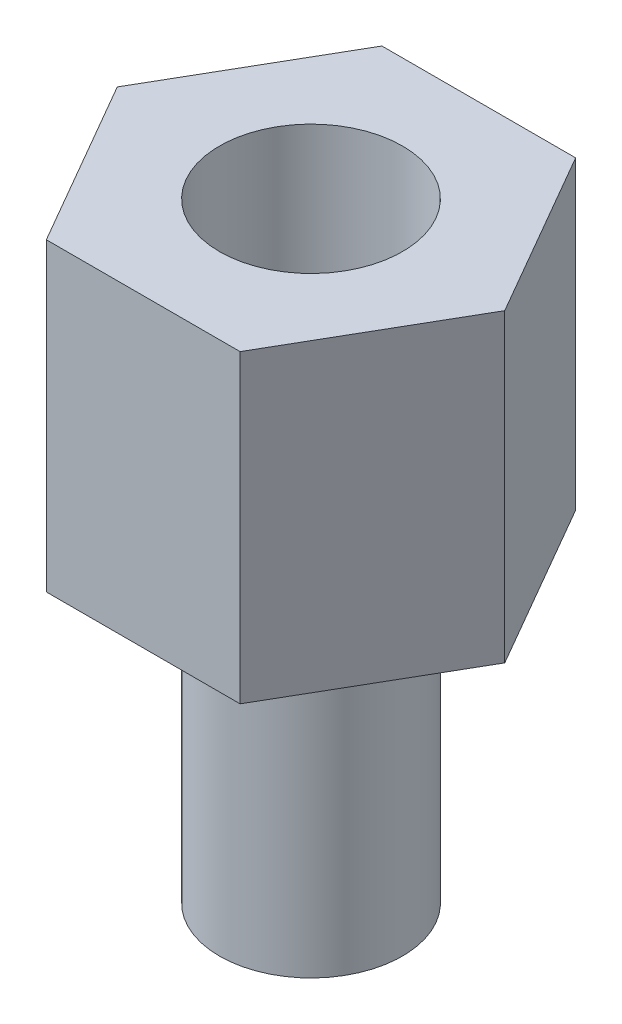
ISO-10303-21;
HEADER;
FILE_DESCRIPTION(('STEP AP214'),'2;1');
FILE_NAME('part.step','',(''),(''),'','','');
FILE_SCHEMA(('AUTOMOTIVE_DESIGN { 1 0 10303 214 1 1 1 1 }'));
ENDSEC;
DATA;
#1=APPLICATION_CONTEXT('core data for automotive mechanical design processes');
#2=APPLICATION_PROTOCOL_DEFINITION('international standard','automotive_design',2000,#1);
#3=PRODUCT_CONTEXT('',#1,'mechanical');
#4=PRODUCT('Part','Part','',(#3));
#5=PRODUCT_RELATED_PRODUCT_CATEGORY('part','',(#4));
#6=PRODUCT_DEFINITION_FORMATION('','',#4);
#7=PRODUCT_DEFINITION_CONTEXT('part definition',#1,'design');
#8=PRODUCT_DEFINITION('design','',#6,#7);
#9=PRODUCT_DEFINITION_SHAPE('','',#8);
#10=(LENGTH_UNIT() NAMED_UNIT(*) SI_UNIT(.MILLI.,.METRE.));
#11=(NAMED_UNIT(*) PLANE_ANGLE_UNIT() SI_UNIT($,.RADIAN.));
#12=(NAMED_UNIT(*) SI_UNIT($,.STERADIAN.) SOLID_ANGLE_UNIT());
#13=UNCERTAINTY_MEASURE_WITH_UNIT(LENGTH_MEASURE(1.E-05),#10,'distance_accuracy_value','');
#14=(GEOMETRIC_REPRESENTATION_CONTEXT(3) GLOBAL_UNCERTAINTY_ASSIGNED_CONTEXT((#13)) GLOBAL_UNIT_ASSIGNED_CONTEXT((#10,
#11,#12)) REPRESENTATION_CONTEXT('',''));
#15=CARTESIAN_POINT('',(0.,0.,0.));
#16=DIRECTION('',(0.,0.,1.));
#17=DIRECTION('',(1.,0.,0.));
#18=AXIS2_PLACEMENT_3D('',#15,#16,#17);
#19=CARTESIAN_POINT('',(0.,5.,0.));
#20=DIRECTION('',(0.,1.,0.));
#21=DIRECTION('',(0.,0.,1.));
#22=AXIS2_PLACEMENT_3D('',#19,#20,#21);
#23=PLANE('',#22);
#24=DIRECTION('',(1.,0.,0.));
#25=VECTOR('',#24,1.);
#26=CARTESIAN_POINT('',(-1.58771324027147,5.,2.75));
#27=LINE('',#26,#25);
#28=CARTESIAN_POINT('',(-1.58771324027147,5.,2.75));
#29=VERTEX_POINT('',#28);
#30=CARTESIAN_POINT('',(1.58771324027147,5.,2.75));
#31=VERTEX_POINT('',#30);
#32=EDGE_CURVE('E138',#29,#31,#27,.T.);
#33=ORIENTED_EDGE('',*,*,#32,.T.);
#34=DIRECTION('',(0.5,0.,-0.866025403784439));
#35=VECTOR('',#34,1.);
#36=CARTESIAN_POINT('',(1.58771324027147,5.,2.75));
#37=LINE('',#36,#35);
#38=CARTESIAN_POINT('',(3.17542648054294,5.,0.));
#39=VERTEX_POINT('',#38);
#40=EDGE_CURVE('E96',#31,#39,#37,.T.);
#41=ORIENTED_EDGE('',*,*,#40,.T.);
#42=DIRECTION('',(-0.5,0.,-0.866025403784438));
#43=VECTOR('',#42,1.);
#44=CARTESIAN_POINT('',(3.17542648054294,5.,0.));
#45=LINE('',#44,#43);
#46=CARTESIAN_POINT('',(1.58771324027147,5.,-2.75));
#47=VERTEX_POINT('',#46);
#48=EDGE_CURVE('E109',#39,#47,#45,.T.);
#49=ORIENTED_EDGE('',*,*,#48,.T.);
#50=DIRECTION('',(-1.,0.,0.));
#51=VECTOR('',#50,1.);
#52=CARTESIAN_POINT('',(1.58771324027147,5.,-2.75));
#53=LINE('',#52,#51);
#54=CARTESIAN_POINT('',(-1.58771324027147,5.,-2.75));
#55=VERTEX_POINT('',#54);
#56=EDGE_CURVE('E103',#47,#55,#53,.T.);
#57=ORIENTED_EDGE('',*,*,#56,.T.);
#58=DIRECTION('',(-0.5,0.,0.866025403784439));
#59=VECTOR('',#58,1.);
#60=CARTESIAN_POINT('',(-1.58771324027147,5.,-2.75));
#61=LINE('',#60,#59);
#62=CARTESIAN_POINT('',(-3.17542648054294,5.,0.));
#63=VERTEX_POINT('',#62);
#64=EDGE_CURVE('E107',#55,#63,#61,.T.);
#65=ORIENTED_EDGE('',*,*,#64,.T.);
#66=DIRECTION('',(0.5,0.,0.866025403784439));
#67=VECTOR('',#66,1.);
#68=CARTESIAN_POINT('',(-3.17542648054294,5.,0.));
#69=LINE('',#68,#67);
#70=EDGE_CURVE('E58',#63,#29,#69,.T.);
#71=ORIENTED_EDGE('',*,*,#70,.T.);
#72=EDGE_LOOP('',(#33,#41,#49,#57,#65,#71));
#73=FACE_BOUND('',#72,.T.);
#74=CARTESIAN_POINT('',(0.,5.,0.));
#75=DIRECTION('',(0.,1.,0.));
#76=DIRECTION('',(0.,0.,1.));
#77=AXIS2_PLACEMENT_3D('',#74,#75,#76);
#78=CIRCLE('',#77,1.5);
#79=CARTESIAN_POINT('',(0.,5.,1.5));
#80=VERTEX_POINT('',#79);
#81=EDGE_CURVE('E131',#80,#80,#78,.T.);
#82=ORIENTED_EDGE('',*,*,#81,.F.);
#83=EDGE_LOOP('',(#82));
#84=FACE_BOUND('',#83,.T.);
#85=ADVANCED_FACE('F41',(#73,#84),#23,.T.);
#86=CARTESIAN_POINT('',(0.,0.,0.));
#87=DIRECTION('',(0.,1.,0.));
#88=DIRECTION('',(0.,0.,1.));
#89=AXIS2_PLACEMENT_3D('',#86,#87,#88);
#90=PLANE('',#89);
#91=DIRECTION('',(1.,0.,0.));
#92=VECTOR('',#91,1.);
#93=CARTESIAN_POINT('',(-1.58771324027147,0.,2.75));
#94=LINE('',#93,#92);
#95=CARTESIAN_POINT('',(-1.58771324027147,0.,2.75));
#96=VERTEX_POINT('',#95);
#97=CARTESIAN_POINT('',(1.58771324027147,0.,2.75));
#98=VERTEX_POINT('',#97);
#99=EDGE_CURVE('E127',#96,#98,#94,.T.);
#100=ORIENTED_EDGE('',*,*,#99,.F.);
#101=DIRECTION('',(0.5,0.,0.866025403784439));
#102=VECTOR('',#101,1.);
#103=CARTESIAN_POINT('',(-3.17542648054294,0.,0.));
#104=LINE('',#103,#102);
#105=CARTESIAN_POINT('',(-3.17542648054294,0.,0.));
#106=VERTEX_POINT('',#105);
#107=EDGE_CURVE('E87',#106,#96,#104,.T.);
#108=ORIENTED_EDGE('',*,*,#107,.F.);
#109=DIRECTION('',(-0.5,0.,0.866025403784439));
#110=VECTOR('',#109,1.);
#111=CARTESIAN_POINT('',(-1.58771324027147,0.,-2.75));
#112=LINE('',#111,#110);
#113=CARTESIAN_POINT('',(-1.58771324027147,0.,-2.75));
#114=VERTEX_POINT('',#113);
#115=EDGE_CURVE('E81',#114,#106,#112,.T.);
#116=ORIENTED_EDGE('',*,*,#115,.F.);
#117=DIRECTION('',(-1.,0.,0.));
#118=VECTOR('',#117,1.);
#119=CARTESIAN_POINT('',(1.58771324027147,0.,-2.75));
#120=LINE('',#119,#118);
#121=CARTESIAN_POINT('',(1.58771324027147,0.,-2.75));
#122=VERTEX_POINT('',#121);
#123=EDGE_CURVE('E117',#122,#114,#120,.T.);
#124=ORIENTED_EDGE('',*,*,#123,.F.);
#125=DIRECTION('',(-0.5,0.,-0.866025403784438));
#126=VECTOR('',#125,1.);
#127=CARTESIAN_POINT('',(3.17542648054294,0.,0.));
#128=LINE('',#127,#126);
#129=CARTESIAN_POINT('',(3.17542648054294,0.,0.));
#130=VERTEX_POINT('',#129);
#131=EDGE_CURVE('E133',#130,#122,#128,.T.);
#132=ORIENTED_EDGE('',*,*,#131,.F.);
#133=DIRECTION('',(0.5,0.,-0.866025403784439));
#134=VECTOR('',#133,1.);
#135=CARTESIAN_POINT('',(1.58771324027147,0.,2.75));
#136=LINE('',#135,#134);
#137=EDGE_CURVE('E130',#98,#130,#136,.T.);
#138=ORIENTED_EDGE('',*,*,#137,.F.);
#139=EDGE_LOOP('',(#100,#108,#116,#124,#132,#138));
#140=FACE_BOUND('',#139,.T.);
#141=CARTESIAN_POINT('',(0.,0.,0.));
#142=DIRECTION('',(0.,1.,0.));
#143=DIRECTION('',(0.,0.,1.));
#144=AXIS2_PLACEMENT_3D('',#141,#142,#143);
#145=CIRCLE('',#144,1.5);
#146=CARTESIAN_POINT('',(0.,0.,1.5));
#147=VERTEX_POINT('',#146);
#148=EDGE_CURVE('E160',#147,#147,#145,.T.);
#149=ORIENTED_EDGE('',*,*,#148,.T.);
#150=EDGE_LOOP('',(#149));
#151=FACE_BOUND('',#150,.T.);
#152=ADVANCED_FACE('F150',(#140,#151),#90,.F.);
#153=CARTESIAN_POINT('',(-1.58771324027147,5.,2.75));
#154=DIRECTION('',(0.,0.,-1.));
#155=DIRECTION('',(-1.,0.,0.));
#156=AXIS2_PLACEMENT_3D('',#153,#154,#155);
#157=PLANE('',#156);
#158=ORIENTED_EDGE('',*,*,#99,.T.);
#159=DIRECTION('',(0.,-1.,0.));
#160=VECTOR('',#159,1.);
#161=CARTESIAN_POINT('',(1.58771324027147,5.,2.75));
#162=LINE('',#161,#160);
#163=EDGE_CURVE('E50',#31,#98,#162,.T.);
#164=ORIENTED_EDGE('',*,*,#163,.F.);
#165=ORIENTED_EDGE('',*,*,#32,.F.);
#166=DIRECTION('',(0.,-1.,0.));
#167=VECTOR('',#166,1.);
#168=CARTESIAN_POINT('',(-1.58771324027147,5.,2.75));
#169=LINE('',#168,#167);
#170=EDGE_CURVE('E123',#29,#96,#169,.T.);
#171=ORIENTED_EDGE('',*,*,#170,.T.);
#172=EDGE_LOOP('',(#158,#164,#165,#171));
#173=FACE_BOUND('',#172,.T.);
#174=ADVANCED_FACE('F43',(#173),#157,.F.);
#175=CARTESIAN_POINT('',(1.58771324027147,5.,2.75));
#176=DIRECTION('',(-0.866025403784439,0.,-0.5));
#177=DIRECTION('',(-0.5,0.,0.866025403784439));
#178=AXIS2_PLACEMENT_3D('',#175,#176,#177);
#179=PLANE('',#178);
#180=ORIENTED_EDGE('',*,*,#137,.T.);
#181=DIRECTION('',(0.,-1.,0.));
#182=VECTOR('',#181,1.);
#183=CARTESIAN_POINT('',(3.17542648054294,5.,0.));
#184=LINE('',#183,#182);
#185=EDGE_CURVE('E142',#39,#130,#184,.T.);
#186=ORIENTED_EDGE('',*,*,#185,.F.);
#187=ORIENTED_EDGE('',*,*,#40,.F.);
#188=ORIENTED_EDGE('',*,*,#163,.T.);
#189=EDGE_LOOP('',(#180,#186,#187,#188));
#190=FACE_BOUND('',#189,.T.);
#191=ADVANCED_FACE('F145',(#190),#179,.F.);
#192=CARTESIAN_POINT('',(3.17542648054294,5.,0.));
#193=DIRECTION('',(-0.866025403784438,0.,0.5));
#194=DIRECTION('',(0.5,0.,0.866025403784439));
#195=AXIS2_PLACEMENT_3D('',#192,#193,#194);
#196=PLANE('',#195);
#197=ORIENTED_EDGE('',*,*,#131,.T.);
#198=DIRECTION('',(0.,-1.,0.));
#199=VECTOR('',#198,1.);
#200=CARTESIAN_POINT('',(1.58771324027147,5.,-2.75));
#201=LINE('',#200,#199);
#202=EDGE_CURVE('E118',#47,#122,#201,.T.);
#203=ORIENTED_EDGE('',*,*,#202,.F.);
#204=ORIENTED_EDGE('',*,*,#48,.F.);
#205=ORIENTED_EDGE('',*,*,#185,.T.);
#206=EDGE_LOOP('',(#197,#203,#204,#205));
#207=FACE_BOUND('',#206,.T.);
#208=ADVANCED_FACE('F154',(#207),#196,.F.);
#209=CARTESIAN_POINT('',(1.58771324027147,5.,-2.75));
#210=DIRECTION('',(0.,0.,1.));
#211=DIRECTION('',(1.,0.,0.));
#212=AXIS2_PLACEMENT_3D('',#209,#210,#211);
#213=PLANE('',#212);
#214=ORIENTED_EDGE('',*,*,#123,.T.);
#215=DIRECTION('',(0.,-1.,0.));
#216=VECTOR('',#215,1.);
#217=CARTESIAN_POINT('',(-1.58771324027147,5.,-2.75));
#218=LINE('',#217,#216);
#219=EDGE_CURVE('E114',#55,#114,#218,.T.);
#220=ORIENTED_EDGE('',*,*,#219,.F.);
#221=ORIENTED_EDGE('',*,*,#56,.F.);
#222=ORIENTED_EDGE('',*,*,#202,.T.);
#223=EDGE_LOOP('',(#214,#220,#221,#222));
#224=FACE_BOUND('',#223,.T.);
#225=ADVANCED_FACE('F115',(#224),#213,.F.);
#226=CARTESIAN_POINT('',(-1.58771324027147,5.,-2.75));
#227=DIRECTION('',(0.866025403784439,0.,0.5));
#228=DIRECTION('',(0.5,0.,-0.866025403784439));
#229=AXIS2_PLACEMENT_3D('',#226,#227,#228);
#230=PLANE('',#229);
#231=ORIENTED_EDGE('',*,*,#115,.T.);
#232=DIRECTION('',(0.,-1.,0.));
#233=VECTOR('',#232,1.);
#234=CARTESIAN_POINT('',(-3.17542648054294,5.,0.));
#235=LINE('',#234,#233);
#236=EDGE_CURVE('E119',#63,#106,#235,.T.);
#237=ORIENTED_EDGE('',*,*,#236,.F.);
#238=ORIENTED_EDGE('',*,*,#64,.F.);
#239=ORIENTED_EDGE('',*,*,#219,.T.);
#240=EDGE_LOOP('',(#231,#237,#238,#239));
#241=FACE_BOUND('',#240,.T.);
#242=ADVANCED_FACE('F121',(#241),#230,.F.);
#243=CARTESIAN_POINT('',(-3.17542648054294,5.,0.));
#244=DIRECTION('',(0.866025403784438,0.,-0.5));
#245=DIRECTION('',(-0.5,0.,-0.866025403784439));
#246=AXIS2_PLACEMENT_3D('',#243,#244,#245);
#247=PLANE('',#246);
#248=ORIENTED_EDGE('',*,*,#107,.T.);
#249=ORIENTED_EDGE('',*,*,#170,.F.);
#250=ORIENTED_EDGE('',*,*,#70,.F.);
#251=ORIENTED_EDGE('',*,*,#236,.T.);
#252=EDGE_LOOP('',(#248,#249,#250,#251));
#253=FACE_BOUND('',#252,.T.);
#254=ADVANCED_FACE('F188',(#253),#247,.F.);
#255=CARTESIAN_POINT('',(0.,5.,0.));
#256=DIRECTION('',(0.,-1.,0.));
#257=DIRECTION('',(0.,0.,-1.));
#258=AXIS2_PLACEMENT_3D('',#255,#256,#257);
#259=CYLINDRICAL_SURFACE('',#258,1.5);
#260=CARTESIAN_POINT('',(0.,2.,0.));
#261=DIRECTION('',(0.,1.,0.));
#262=DIRECTION('',(0.,0.,1.));
#263=AXIS2_PLACEMENT_3D('',#260,#261,#262);
#264=CIRCLE('',#263,1.5);
#265=CARTESIAN_POINT('',(0.,2.,1.5));
#266=VERTEX_POINT('',#265);
#267=EDGE_CURVE('E11',#266,#266,#264,.T.);
#268=ORIENTED_EDGE('',*,*,#267,.F.);
#269=EDGE_LOOP('',(#268));
#270=FACE_BOUND('',#269,.T.);
#271=ORIENTED_EDGE('',*,*,#81,.T.);
#272=EDGE_LOOP('',(#271));
#273=FACE_BOUND('',#272,.T.);
#274=ADVANCED_FACE('F186',(#270,#273),#259,.F.);
#275=CARTESIAN_POINT('',(0.,2.,0.));
#276=DIRECTION('',(0.,1.,0.));
#277=DIRECTION('',(0.,0.,1.));
#278=AXIS2_PLACEMENT_3D('',#275,#276,#277);
#279=PLANE('',#278);
#280=ORIENTED_EDGE('',*,*,#267,.T.);
#281=EDGE_LOOP('',(#280));
#282=FACE_BOUND('',#281,.T.);
#283=ADVANCED_FACE('F176',(#282),#279,.T.);
#284=CARTESIAN_POINT('',(0.,-5.,0.));
#285=DIRECTION('',(0.,1.,0.));
#286=DIRECTION('',(0.,0.,1.));
#287=AXIS2_PLACEMENT_3D('',#284,#285,#286);
#288=CYLINDRICAL_SURFACE('',#287,1.5);
#289=CARTESIAN_POINT('',(0.,-5.,0.));
#290=DIRECTION('',(0.,1.,0.));
#291=DIRECTION('',(0.,0.,1.));
#292=AXIS2_PLACEMENT_3D('',#289,#290,#291);
#293=CIRCLE('',#292,1.5);
#294=CARTESIAN_POINT('',(0.,-5.,1.5));
#295=VERTEX_POINT('',#294);
#296=EDGE_CURVE('E163',#295,#295,#293,.T.);
#297=ORIENTED_EDGE('',*,*,#296,.T.);
#298=EDGE_LOOP('',(#297));
#299=FACE_BOUND('',#298,.T.);
#300=ORIENTED_EDGE('',*,*,#148,.F.);
#301=EDGE_LOOP('',(#300));
#302=FACE_BOUND('',#301,.T.);
#303=ADVANCED_FACE('F167',(#299,#302),#288,.T.);
#304=CARTESIAN_POINT('',(0.,-5.,0.));
#305=DIRECTION('',(0.,1.,0.));
#306=DIRECTION('',(0.,0.,1.));
#307=AXIS2_PLACEMENT_3D('',#304,#305,#306);
#308=PLANE('',#307);
#309=ORIENTED_EDGE('',*,*,#296,.F.);
#310=EDGE_LOOP('',(#309));
#311=FACE_BOUND('',#310,.T.);
#312=ADVANCED_FACE('F170',(#311),#308,.F.);
#313=CLOSED_SHELL('',(#85,#152,#174,#191,#208,#225,#242,#254,#274,#283,#303,#312));
#314=MANIFOLD_SOLID_BREP('B2',#313);
#315=ADVANCED_BREP_SHAPE_REPRESENTATION('',(#18,#314),#14);
#316=SHAPE_DEFINITION_REPRESENTATION(#9,#315);
ENDSEC;
END-ISO-10303-21;
